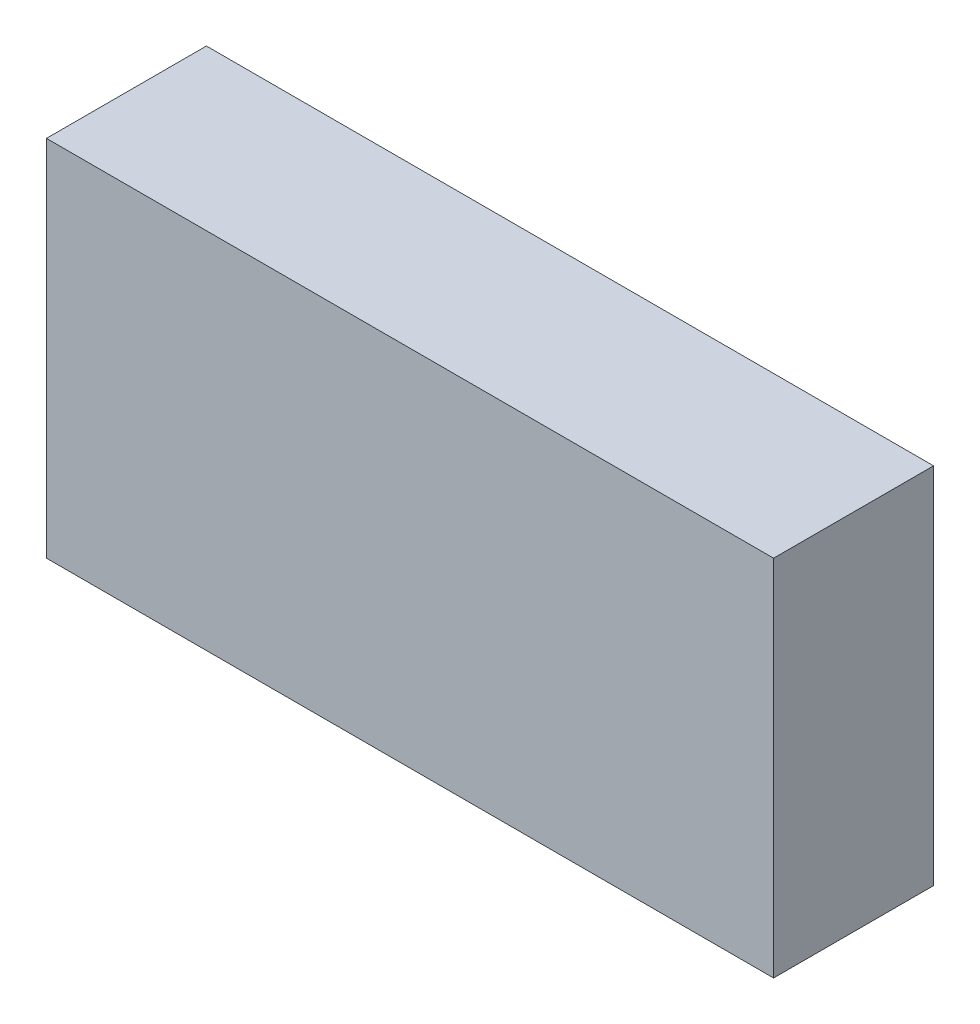
ISO-10303-21;
HEADER;
FILE_DESCRIPTION(('STEP AP214'),'2;1');
FILE_NAME('part.step','',(''),(''),'','','');
FILE_SCHEMA(('AUTOMOTIVE_DESIGN { 1 0 10303 214 1 1 1 1 }'));
ENDSEC;
DATA;
#1=APPLICATION_CONTEXT('core data for automotive mechanical design processes');
#2=APPLICATION_PROTOCOL_DEFINITION('international standard','automotive_design',2000,#1);
#3=PRODUCT_CONTEXT('',#1,'mechanical');
#4=PRODUCT('Part','Part','',(#3));
#5=PRODUCT_RELATED_PRODUCT_CATEGORY('part','',(#4));
#6=PRODUCT_DEFINITION_FORMATION('','',#4);
#7=PRODUCT_DEFINITION_CONTEXT('part definition',#1,'design');
#8=PRODUCT_DEFINITION('design','',#6,#7);
#9=PRODUCT_DEFINITION_SHAPE('','',#8);
#10=(LENGTH_UNIT() NAMED_UNIT(*) SI_UNIT(.MILLI.,.METRE.));
#11=(NAMED_UNIT(*) PLANE_ANGLE_UNIT() SI_UNIT($,.RADIAN.));
#12=(NAMED_UNIT(*) SI_UNIT($,.STERADIAN.) SOLID_ANGLE_UNIT());
#13=UNCERTAINTY_MEASURE_WITH_UNIT(LENGTH_MEASURE(1.E-05),#10,'distance_accuracy_value','');
#14=(GEOMETRIC_REPRESENTATION_CONTEXT(3) GLOBAL_UNCERTAINTY_ASSIGNED_CONTEXT((#13)) GLOBAL_UNIT_ASSIGNED_CONTEXT((#10,
#11,#12)) REPRESENTATION_CONTEXT('',''));
#15=CARTESIAN_POINT('',(0.,0.,0.));
#16=DIRECTION('',(0.,0.,1.));
#17=DIRECTION('',(1.,0.,0.));
#18=AXIS2_PLACEMENT_3D('',#15,#16,#17);
#19=CARTESIAN_POINT('',(0.,0.,-1.));
#20=DIRECTION('',(-1.,0.,0.));
#21=DIRECTION('',(0.,-1.,0.));
#22=AXIS2_PLACEMENT_3D('',#19,#20,#21);
#23=PLANE('',#22);
#24=DIRECTION('',(0.,0.,1.));
#25=VECTOR('',#24,1.);
#26=CARTESIAN_POINT('',(0.,0.,-1.));
#27=LINE('',#26,#25);
#28=CARTESIAN_POINT('',(0.,0.,-1.));
#29=VERTEX_POINT('',#28);
#30=CARTESIAN_POINT('',(0.,0.,10.));
#31=VERTEX_POINT('',#30);
#32=EDGE_CURVE('E37',#29,#31,#27,.T.);
#33=ORIENTED_EDGE('',*,*,#32,.T.);
#34=DIRECTION('',(0.,-1.,0.));
#35=VECTOR('',#34,1.);
#36=CARTESIAN_POINT('',(0.,0.,10.));
#37=LINE('',#36,#35);
#38=CARTESIAN_POINT('',(0.,25.,10.));
#39=VERTEX_POINT('',#38);
#40=EDGE_CURVE('E74',#39,#31,#37,.T.);
#41=ORIENTED_EDGE('',*,*,#40,.F.);
#42=DIRECTION('',(0.,0.,1.));
#43=VECTOR('',#42,1.);
#44=CARTESIAN_POINT('',(0.,25.,-1.));
#45=LINE('',#44,#43);
#46=CARTESIAN_POINT('',(0.,25.,-1.));
#47=VERTEX_POINT('',#46);
#48=EDGE_CURVE('E11',#47,#39,#45,.T.);
#49=ORIENTED_EDGE('',*,*,#48,.F.);
#50=DIRECTION('',(0.,-1.,0.));
#51=VECTOR('',#50,1.);
#52=CARTESIAN_POINT('',(0.,0.,-1.));
#53=LINE('',#52,#51);
#54=EDGE_CURVE('E75',#47,#29,#53,.T.);
#55=ORIENTED_EDGE('',*,*,#54,.T.);
#56=EDGE_LOOP('',(#33,#41,#49,#55));
#57=FACE_BOUND('',#56,.T.);
#58=ADVANCED_FACE('F34',(#57),#23,.T.);
#59=CARTESIAN_POINT('',(0.,25.,-1.));
#60=DIRECTION('',(0.,1.,0.));
#61=DIRECTION('',(0.,0.,1.));
#62=AXIS2_PLACEMENT_3D('',#59,#60,#61);
#63=PLANE('',#62);
#64=ORIENTED_EDGE('',*,*,#48,.T.);
#65=DIRECTION('',(-1.,0.,0.));
#66=VECTOR('',#65,1.);
#67=CARTESIAN_POINT('',(0.,25.,10.));
#68=LINE('',#67,#66);
#69=CARTESIAN_POINT('',(50.,25.,10.));
#70=VERTEX_POINT('',#69);
#71=EDGE_CURVE('E91',#70,#39,#68,.T.);
#72=ORIENTED_EDGE('',*,*,#71,.F.);
#73=DIRECTION('',(0.,0.,1.));
#74=VECTOR('',#73,1.);
#75=CARTESIAN_POINT('',(50.,25.,-1.));
#76=LINE('',#75,#74);
#77=CARTESIAN_POINT('',(50.,25.,-1.));
#78=VERTEX_POINT('',#77);
#79=EDGE_CURVE('E42',#78,#70,#76,.T.);
#80=ORIENTED_EDGE('',*,*,#79,.F.);
#81=DIRECTION('',(-1.,0.,0.));
#82=VECTOR('',#81,1.);
#83=CARTESIAN_POINT('',(0.,25.,-1.));
#84=LINE('',#83,#82);
#85=EDGE_CURVE('E80',#78,#47,#84,.T.);
#86=ORIENTED_EDGE('',*,*,#85,.T.);
#87=EDGE_LOOP('',(#64,#72,#80,#86));
#88=FACE_BOUND('',#87,.T.);
#89=ADVANCED_FACE('F106',(#88),#63,.T.);
#90=CARTESIAN_POINT('',(50.,0.,-1.));
#91=DIRECTION('',(1.,0.,0.));
#92=DIRECTION('',(0.,1.,0.));
#93=AXIS2_PLACEMENT_3D('',#90,#91,#92);
#94=PLANE('',#93);
#95=ORIENTED_EDGE('',*,*,#79,.T.);
#96=DIRECTION('',(0.,1.,0.));
#97=VECTOR('',#96,1.);
#98=CARTESIAN_POINT('',(50.,0.,10.));
#99=LINE('',#98,#97);
#100=CARTESIAN_POINT('',(50.,0.,10.));
#101=VERTEX_POINT('',#100);
#102=EDGE_CURVE('E87',#101,#70,#99,.T.);
#103=ORIENTED_EDGE('',*,*,#102,.F.);
#104=DIRECTION('',(0.,0.,1.));
#105=VECTOR('',#104,1.);
#106=CARTESIAN_POINT('',(50.,0.,-1.));
#107=LINE('',#106,#105);
#108=CARTESIAN_POINT('',(50.,0.,-1.));
#109=VERTEX_POINT('',#108);
#110=EDGE_CURVE('E79',#109,#101,#107,.T.);
#111=ORIENTED_EDGE('',*,*,#110,.F.);
#112=DIRECTION('',(0.,1.,0.));
#113=VECTOR('',#112,1.);
#114=CARTESIAN_POINT('',(50.,0.,-1.));
#115=LINE('',#114,#113);
#116=EDGE_CURVE('E99',#109,#78,#115,.T.);
#117=ORIENTED_EDGE('',*,*,#116,.T.);
#118=EDGE_LOOP('',(#95,#103,#111,#117));
#119=FACE_BOUND('',#118,.T.);
#120=ADVANCED_FACE('F103',(#119),#94,.T.);
#121=CARTESIAN_POINT('',(0.,0.,-1.));
#122=DIRECTION('',(0.,-1.,0.));
#123=DIRECTION('',(0.,0.,-1.));
#124=AXIS2_PLACEMENT_3D('',#121,#122,#123);
#125=PLANE('',#124);
#126=ORIENTED_EDGE('',*,*,#110,.T.);
#127=DIRECTION('',(1.,0.,0.));
#128=VECTOR('',#127,1.);
#129=CARTESIAN_POINT('',(0.,0.,10.));
#130=LINE('',#129,#128);
#131=EDGE_CURVE('E82',#31,#101,#130,.T.);
#132=ORIENTED_EDGE('',*,*,#131,.F.);
#133=ORIENTED_EDGE('',*,*,#32,.F.);
#134=DIRECTION('',(1.,0.,0.));
#135=VECTOR('',#134,1.);
#136=CARTESIAN_POINT('',(0.,0.,-1.));
#137=LINE('',#136,#135);
#138=EDGE_CURVE('E97',#29,#109,#137,.T.);
#139=ORIENTED_EDGE('',*,*,#138,.T.);
#140=EDGE_LOOP('',(#126,#132,#133,#139));
#141=FACE_BOUND('',#140,.T.);
#142=ADVANCED_FACE('F83',(#141),#125,.T.);
#143=CARTESIAN_POINT('',(0.,0.,-1.));
#144=DIRECTION('',(0.,0.,-1.));
#145=DIRECTION('',(-1.,0.,0.));
#146=AXIS2_PLACEMENT_3D('',#143,#144,#145);
#147=PLANE('',#146);
#148=ORIENTED_EDGE('',*,*,#54,.F.);
#149=ORIENTED_EDGE('',*,*,#85,.F.);
#150=ORIENTED_EDGE('',*,*,#116,.F.);
#151=ORIENTED_EDGE('',*,*,#138,.F.);
#152=EDGE_LOOP('',(#148,#149,#150,#151));
#153=FACE_BOUND('',#152,.T.);
#154=ADVANCED_FACE('F108',(#153),#147,.T.);
#155=CARTESIAN_POINT('',(0.,0.,10.));
#156=DIRECTION('',(0.,0.,-1.));
#157=DIRECTION('',(-1.,0.,0.));
#158=AXIS2_PLACEMENT_3D('',#155,#156,#157);
#159=PLANE('',#158);
#160=ORIENTED_EDGE('',*,*,#40,.T.);
#161=ORIENTED_EDGE('',*,*,#131,.T.);
#162=ORIENTED_EDGE('',*,*,#102,.T.);
#163=ORIENTED_EDGE('',*,*,#71,.T.);
#164=EDGE_LOOP('',(#160,#161,#162,#163));
#165=FACE_BOUND('',#164,.T.);
#166=ADVANCED_FACE('F90',(#165),#159,.F.);
#167=CLOSED_SHELL('',(#58,#89,#120,#142,#154,#166));
#168=MANIFOLD_SOLID_BREP('B2',#167);
#169=ADVANCED_BREP_SHAPE_REPRESENTATION('',(#18,#168),#14);
#170=SHAPE_DEFINITION_REPRESENTATION(#9,#169);
ENDSEC;
END-ISO-10303-21;
